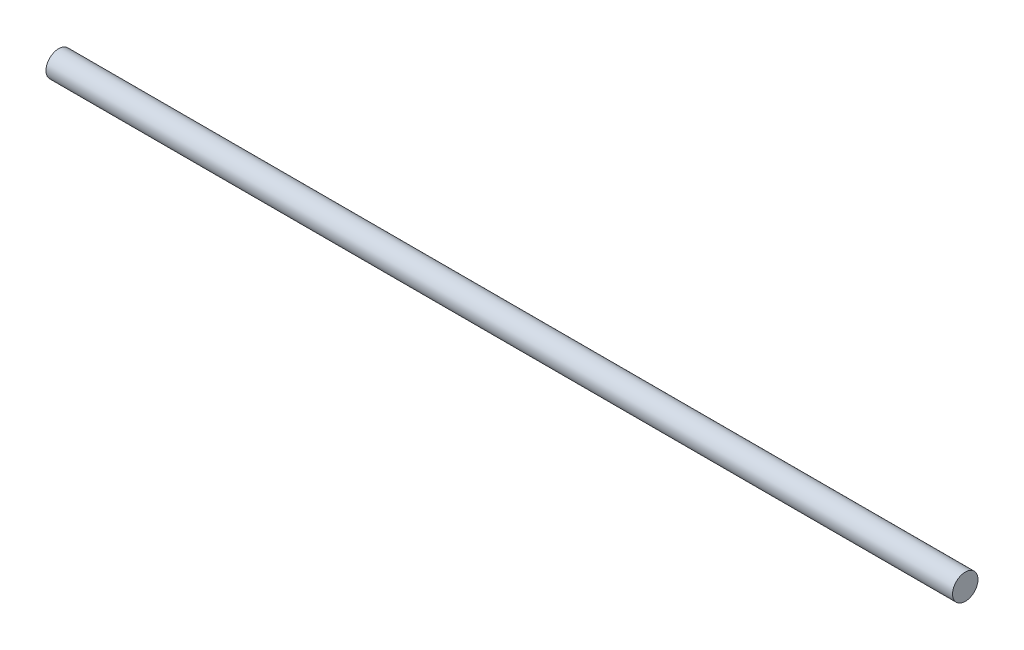
ISO-10303-21;
HEADER;
FILE_DESCRIPTION(('STEP AP214'),'2;1');
FILE_NAME('part.step','',(''),(''),'','','');
FILE_SCHEMA(('AUTOMOTIVE_DESIGN { 1 0 10303 214 1 1 1 1 }'));
ENDSEC;
DATA;
#1=APPLICATION_CONTEXT('core data for automotive mechanical design processes');
#2=APPLICATION_PROTOCOL_DEFINITION('international standard','automotive_design',2000,#1);
#3=PRODUCT_CONTEXT('',#1,'mechanical');
#4=PRODUCT('Part','Part','',(#3));
#5=PRODUCT_RELATED_PRODUCT_CATEGORY('part','',(#4));
#6=PRODUCT_DEFINITION_FORMATION('','',#4);
#7=PRODUCT_DEFINITION_CONTEXT('part definition',#1,'design');
#8=PRODUCT_DEFINITION('design','',#6,#7);
#9=PRODUCT_DEFINITION_SHAPE('','',#8);
#10=(LENGTH_UNIT() NAMED_UNIT(*) SI_UNIT(.MILLI.,.METRE.));
#11=(NAMED_UNIT(*) PLANE_ANGLE_UNIT() SI_UNIT($,.RADIAN.));
#12=(NAMED_UNIT(*) SI_UNIT($,.STERADIAN.) SOLID_ANGLE_UNIT());
#13=UNCERTAINTY_MEASURE_WITH_UNIT(LENGTH_MEASURE(1.E-05),#10,'distance_accuracy_value','');
#14=(GEOMETRIC_REPRESENTATION_CONTEXT(3) GLOBAL_UNCERTAINTY_ASSIGNED_CONTEXT((#13)) GLOBAL_UNIT_ASSIGNED_CONTEXT((#10,
#11,#12)) REPRESENTATION_CONTEXT('',''));
#15=CARTESIAN_POINT('',(0.,0.,0.));
#16=DIRECTION('',(0.,0.,1.));
#17=DIRECTION('',(1.,0.,0.));
#18=AXIS2_PLACEMENT_3D('',#15,#16,#17);
#19=CARTESIAN_POINT('',(285.,0.,0.));
#20=DIRECTION('',(-1.,0.,0.));
#21=DIRECTION('',(0.,0.,1.));
#22=AXIS2_PLACEMENT_3D('',#19,#20,#21);
#23=CYLINDRICAL_SURFACE('',#22,4.);
#24=CARTESIAN_POINT('',(285.,0.,0.));
#25=DIRECTION('',(1.,0.,0.));
#26=DIRECTION('',(0.,0.,-1.));
#27=AXIS2_PLACEMENT_3D('',#24,#25,#26);
#28=CIRCLE('',#27,4.);
#29=CARTESIAN_POINT('',(285.,0.,-4.));
#30=VERTEX_POINT('',#29);
#31=EDGE_CURVE('E10',#30,#30,#28,.T.);
#32=ORIENTED_EDGE('',*,*,#31,.F.);
#33=EDGE_LOOP('',(#32));
#34=FACE_BOUND('',#33,.T.);
#35=CARTESIAN_POINT('',(0.,0.,0.));
#36=DIRECTION('',(1.,0.,0.));
#37=DIRECTION('',(0.,0.,-1.));
#38=AXIS2_PLACEMENT_3D('',#35,#36,#37);
#39=CIRCLE('',#38,4.);
#40=CARTESIAN_POINT('',(0.,0.,-4.));
#41=VERTEX_POINT('',#40);
#42=EDGE_CURVE('E35',#41,#41,#39,.T.);
#43=ORIENTED_EDGE('',*,*,#42,.T.);
#44=EDGE_LOOP('',(#43));
#45=FACE_BOUND('',#44,.T.);
#46=ADVANCED_FACE('F32',(#34,#45),#23,.T.);
#47=CARTESIAN_POINT('',(285.,0.,0.));
#48=DIRECTION('',(1.,0.,0.));
#49=DIRECTION('',(0.,0.,-1.));
#50=AXIS2_PLACEMENT_3D('',#47,#48,#49);
#51=PLANE('',#50);
#52=ORIENTED_EDGE('',*,*,#31,.T.);
#53=EDGE_LOOP('',(#52));
#54=FACE_BOUND('',#53,.T.);
#55=ADVANCED_FACE('F47',(#54),#51,.T.);
#56=CARTESIAN_POINT('',(0.,0.,0.));
#57=DIRECTION('',(1.,0.,0.));
#58=DIRECTION('',(0.,0.,-1.));
#59=AXIS2_PLACEMENT_3D('',#56,#57,#58);
#60=PLANE('',#59);
#61=ORIENTED_EDGE('',*,*,#42,.F.);
#62=EDGE_LOOP('',(#61));
#63=FACE_BOUND('',#62,.T.);
#64=ADVANCED_FACE('F45',(#63),#60,.F.);
#65=CLOSED_SHELL('',(#46,#55,#64));
#66=MANIFOLD_SOLID_BREP('B2',#65);
#67=ADVANCED_BREP_SHAPE_REPRESENTATION('',(#18,#66),#14);
#68=SHAPE_DEFINITION_REPRESENTATION(#9,#67);
ENDSEC;
END-ISO-10303-21;
